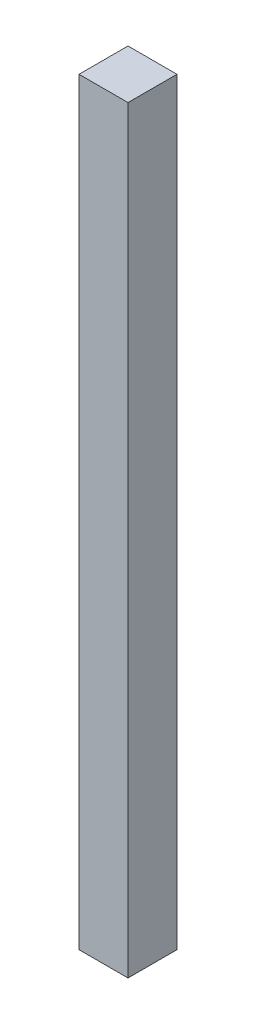
ISO-10303-21;
HEADER;
FILE_DESCRIPTION(('STEP AP214'),'2;1');
FILE_NAME('part.step','',(''),(''),'','','');
FILE_SCHEMA(('AUTOMOTIVE_DESIGN { 1 0 10303 214 1 1 1 1 }'));
ENDSEC;
DATA;
#1=APPLICATION_CONTEXT('core data for automotive mechanical design processes');
#2=APPLICATION_PROTOCOL_DEFINITION('international standard','automotive_design',2000,#1);
#3=PRODUCT_CONTEXT('',#1,'mechanical');
#4=PRODUCT('Part','Part','',(#3));
#5=PRODUCT_RELATED_PRODUCT_CATEGORY('part','',(#4));
#6=PRODUCT_DEFINITION_FORMATION('','',#4);
#7=PRODUCT_DEFINITION_CONTEXT('part definition',#1,'design');
#8=PRODUCT_DEFINITION('design','',#6,#7);
#9=PRODUCT_DEFINITION_SHAPE('','',#8);
#10=(LENGTH_UNIT() NAMED_UNIT(*) SI_UNIT(.MILLI.,.METRE.));
#11=(NAMED_UNIT(*) PLANE_ANGLE_UNIT() SI_UNIT($,.RADIAN.));
#12=(NAMED_UNIT(*) SI_UNIT($,.STERADIAN.) SOLID_ANGLE_UNIT());
#13=UNCERTAINTY_MEASURE_WITH_UNIT(LENGTH_MEASURE(1.E-05),#10,'distance_accuracy_value','');
#14=(GEOMETRIC_REPRESENTATION_CONTEXT(3) GLOBAL_UNCERTAINTY_ASSIGNED_CONTEXT((#13)) GLOBAL_UNIT_ASSIGNED_CONTEXT((#10,
#11,#12)) REPRESENTATION_CONTEXT('',''));
#15=CARTESIAN_POINT('',(0.,0.,0.));
#16=DIRECTION('',(0.,0.,1.));
#17=DIRECTION('',(1.,0.,0.));
#18=AXIS2_PLACEMENT_3D('',#15,#16,#17);
#19=CARTESIAN_POINT('',(0.,393.2,0.));
#20=DIRECTION('',(1.,0.,0.));
#21=DIRECTION('',(0.,0.,-1.));
#22=AXIS2_PLACEMENT_3D('',#19,#20,#21);
#23=PLANE('',#22);
#24=DIRECTION('',(0.,0.,1.));
#25=VECTOR('',#24,1.);
#26=CARTESIAN_POINT('',(0.,0.,0.));
#27=LINE('',#26,#25);
#28=CARTESIAN_POINT('',(0.,0.,-25.4));
#29=VERTEX_POINT('',#28);
#30=CARTESIAN_POINT('',(0.,0.,0.));
#31=VERTEX_POINT('',#30);
#32=EDGE_CURVE('E111',#29,#31,#27,.T.);
#33=ORIENTED_EDGE('',*,*,#32,.T.);
#34=DIRECTION('',(0.,-1.,0.));
#35=VECTOR('',#34,1.);
#36=CARTESIAN_POINT('',(0.,393.2,0.));
#37=LINE('',#36,#35);
#38=CARTESIAN_POINT('',(0.,393.2,0.));
#39=VERTEX_POINT('',#38);
#40=EDGE_CURVE('E11',#39,#31,#37,.T.);
#41=ORIENTED_EDGE('',*,*,#40,.F.);
#42=DIRECTION('',(0.,0.,1.));
#43=VECTOR('',#42,1.);
#44=CARTESIAN_POINT('',(0.,393.2,0.));
#45=LINE('',#44,#43);
#46=CARTESIAN_POINT('',(0.,393.2,-25.4));
#47=VERTEX_POINT('',#46);
#48=EDGE_CURVE('E95',#47,#39,#45,.T.);
#49=ORIENTED_EDGE('',*,*,#48,.F.);
#50=DIRECTION('',(0.,-1.,0.));
#51=VECTOR('',#50,1.);
#52=CARTESIAN_POINT('',(0.,393.2,-25.4));
#53=LINE('',#52,#51);
#54=EDGE_CURVE('E107',#47,#29,#53,.T.);
#55=ORIENTED_EDGE('',*,*,#54,.T.);
#56=EDGE_LOOP('',(#33,#41,#49,#55));
#57=FACE_BOUND('',#56,.T.);
#58=ADVANCED_FACE('F43',(#57),#23,.F.);
#59=CARTESIAN_POINT('',(0.,393.2,0.));
#60=DIRECTION('',(0.,0.,-1.));
#61=DIRECTION('',(-1.,0.,0.));
#62=AXIS2_PLACEMENT_3D('',#59,#60,#61);
#63=PLANE('',#62);
#64=DIRECTION('',(1.,0.,0.));
#65=VECTOR('',#64,1.);
#66=CARTESIAN_POINT('',(0.,0.,0.));
#67=LINE('',#66,#65);
#68=CARTESIAN_POINT('',(25.4,0.,0.));
#69=VERTEX_POINT('',#68);
#70=EDGE_CURVE('E100',#31,#69,#67,.T.);
#71=ORIENTED_EDGE('',*,*,#70,.T.);
#72=DIRECTION('',(0.,-1.,0.));
#73=VECTOR('',#72,1.);
#74=CARTESIAN_POINT('',(25.4,393.2,0.));
#75=LINE('',#74,#73);
#76=CARTESIAN_POINT('',(25.4,393.2,0.));
#77=VERTEX_POINT('',#76);
#78=EDGE_CURVE('E52',#77,#69,#75,.T.);
#79=ORIENTED_EDGE('',*,*,#78,.F.);
#80=DIRECTION('',(1.,0.,0.));
#81=VECTOR('',#80,1.);
#82=CARTESIAN_POINT('',(0.,393.2,0.));
#83=LINE('',#82,#81);
#84=EDGE_CURVE('E90',#39,#77,#83,.T.);
#85=ORIENTED_EDGE('',*,*,#84,.F.);
#86=ORIENTED_EDGE('',*,*,#40,.T.);
#87=EDGE_LOOP('',(#71,#79,#85,#86));
#88=FACE_BOUND('',#87,.T.);
#89=ADVANCED_FACE('F99',(#88),#63,.F.);
#90=CARTESIAN_POINT('',(25.4,393.2,0.));
#91=DIRECTION('',(-1.,0.,0.));
#92=DIRECTION('',(0.,0.,1.));
#93=AXIS2_PLACEMENT_3D('',#90,#91,#92);
#94=PLANE('',#93);
#95=DIRECTION('',(0.,0.,-1.));
#96=VECTOR('',#95,1.);
#97=CARTESIAN_POINT('',(25.4,0.,0.));
#98=LINE('',#97,#96);
#99=CARTESIAN_POINT('',(25.4,0.,-25.4));
#100=VERTEX_POINT('',#99);
#101=EDGE_CURVE('E77',#69,#100,#98,.T.);
#102=ORIENTED_EDGE('',*,*,#101,.T.);
#103=DIRECTION('',(0.,-1.,0.));
#104=VECTOR('',#103,1.);
#105=CARTESIAN_POINT('',(25.4,393.2,-25.4));
#106=LINE('',#105,#104);
#107=CARTESIAN_POINT('',(25.4,393.2,-25.4));
#108=VERTEX_POINT('',#107);
#109=EDGE_CURVE('E102',#108,#100,#106,.T.);
#110=ORIENTED_EDGE('',*,*,#109,.F.);
#111=DIRECTION('',(0.,0.,-1.));
#112=VECTOR('',#111,1.);
#113=CARTESIAN_POINT('',(25.4,393.2,0.));
#114=LINE('',#113,#112);
#115=EDGE_CURVE('E93',#77,#108,#114,.T.);
#116=ORIENTED_EDGE('',*,*,#115,.F.);
#117=ORIENTED_EDGE('',*,*,#78,.T.);
#118=EDGE_LOOP('',(#102,#110,#116,#117));
#119=FACE_BOUND('',#118,.T.);
#120=ADVANCED_FACE('F103',(#119),#94,.F.);
#121=CARTESIAN_POINT('',(0.,393.2,-25.4));
#122=DIRECTION('',(0.,0.,1.));
#123=DIRECTION('',(1.,0.,0.));
#124=AXIS2_PLACEMENT_3D('',#121,#122,#123);
#125=PLANE('',#124);
#126=DIRECTION('',(-1.,0.,0.));
#127=VECTOR('',#126,1.);
#128=CARTESIAN_POINT('',(0.,0.,-25.4));
#129=LINE('',#128,#127);
#130=EDGE_CURVE('E83',#100,#29,#129,.T.);
#131=ORIENTED_EDGE('',*,*,#130,.T.);
#132=ORIENTED_EDGE('',*,*,#54,.F.);
#133=DIRECTION('',(-1.,0.,0.));
#134=VECTOR('',#133,1.);
#135=CARTESIAN_POINT('',(0.,393.2,-25.4));
#136=LINE('',#135,#134);
#137=EDGE_CURVE('E60',#108,#47,#136,.T.);
#138=ORIENTED_EDGE('',*,*,#137,.F.);
#139=ORIENTED_EDGE('',*,*,#109,.T.);
#140=EDGE_LOOP('',(#131,#132,#138,#139));
#141=FACE_BOUND('',#140,.T.);
#142=ADVANCED_FACE('F124',(#141),#125,.F.);
#143=CARTESIAN_POINT('',(0.,393.2,0.));
#144=DIRECTION('',(0.,-1.,0.));
#145=DIRECTION('',(0.,0.,-1.));
#146=AXIS2_PLACEMENT_3D('',#143,#144,#145);
#147=PLANE('',#146);
#148=ORIENTED_EDGE('',*,*,#48,.T.);
#149=ORIENTED_EDGE('',*,*,#84,.T.);
#150=ORIENTED_EDGE('',*,*,#115,.T.);
#151=ORIENTED_EDGE('',*,*,#137,.T.);
#152=EDGE_LOOP('',(#148,#149,#150,#151));
#153=FACE_BOUND('',#152,.T.);
#154=ADVANCED_FACE('F91',(#153),#147,.F.);
#155=CARTESIAN_POINT('',(0.,0.,0.));
#156=DIRECTION('',(0.,-1.,0.));
#157=DIRECTION('',(0.,0.,-1.));
#158=AXIS2_PLACEMENT_3D('',#155,#156,#157);
#159=PLANE('',#158);
#160=ORIENTED_EDGE('',*,*,#32,.F.);
#161=ORIENTED_EDGE('',*,*,#130,.F.);
#162=ORIENTED_EDGE('',*,*,#101,.F.);
#163=ORIENTED_EDGE('',*,*,#70,.F.);
#164=EDGE_LOOP('',(#160,#161,#162,#163));
#165=FACE_BOUND('',#164,.T.);
#166=ADVANCED_FACE('F127',(#165),#159,.T.);
#167=CLOSED_SHELL('',(#58,#89,#120,#142,#154,#166));
#168=MANIFOLD_SOLID_BREP('B2',#167);
#169=ADVANCED_BREP_SHAPE_REPRESENTATION('',(#18,#168),#14);
#170=SHAPE_DEFINITION_REPRESENTATION(#9,#169);
ENDSEC;
END-ISO-10303-21;
